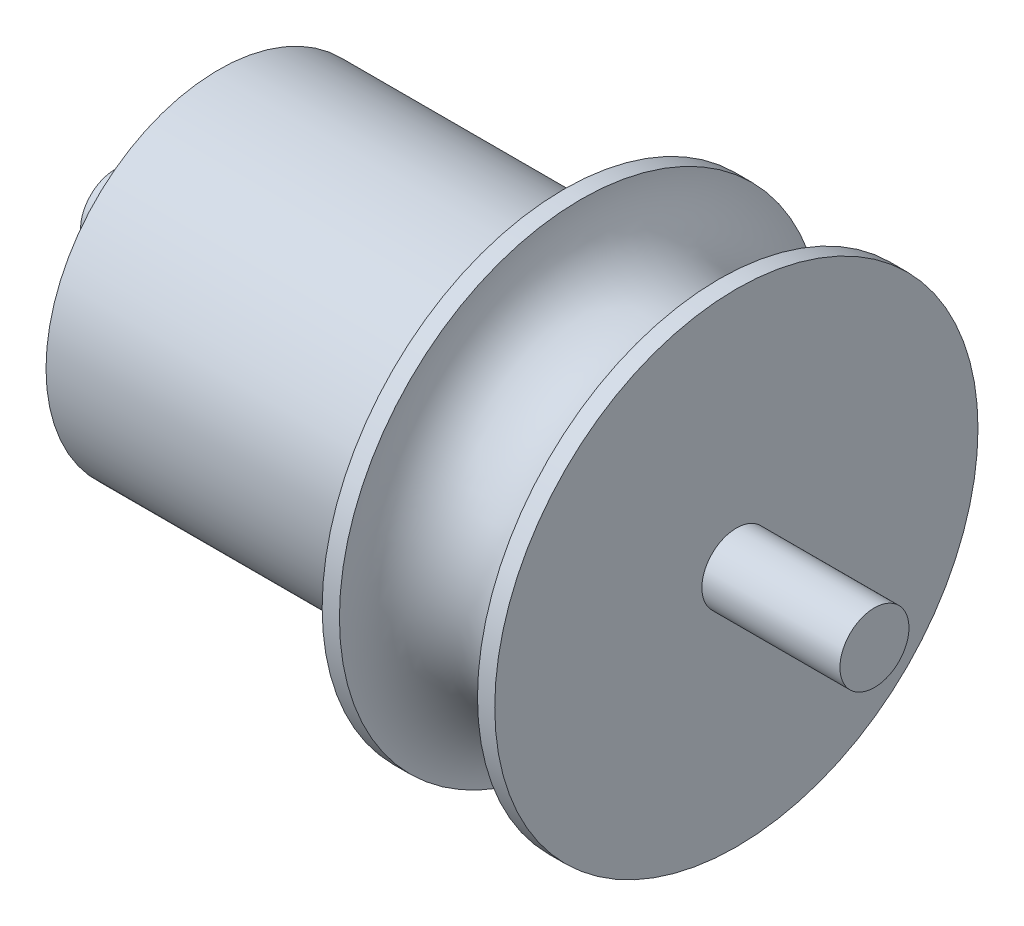
ISO-10303-21;
HEADER;
FILE_DESCRIPTION(('STEP AP214'),'2;1');
FILE_NAME('part.step','',(''),(''),'','','');
FILE_SCHEMA(('AUTOMOTIVE_DESIGN { 1 0 10303 214 1 1 1 1 }'));
ENDSEC;
DATA;
#1=APPLICATION_CONTEXT('core data for automotive mechanical design processes');
#2=APPLICATION_PROTOCOL_DEFINITION('international standard','automotive_design',2000,#1);
#3=PRODUCT_CONTEXT('',#1,'mechanical');
#4=PRODUCT('Part','Part','',(#3));
#5=PRODUCT_RELATED_PRODUCT_CATEGORY('part','',(#4));
#6=PRODUCT_DEFINITION_FORMATION('','',#4);
#7=PRODUCT_DEFINITION_CONTEXT('part definition',#1,'design');
#8=PRODUCT_DEFINITION('design','',#6,#7);
#9=PRODUCT_DEFINITION_SHAPE('','',#8);
#10=(LENGTH_UNIT() NAMED_UNIT(*) SI_UNIT(.MILLI.,.METRE.));
#11=(NAMED_UNIT(*) PLANE_ANGLE_UNIT() SI_UNIT($,.RADIAN.));
#12=(NAMED_UNIT(*) SI_UNIT($,.STERADIAN.) SOLID_ANGLE_UNIT());
#13=UNCERTAINTY_MEASURE_WITH_UNIT(LENGTH_MEASURE(1.E-05),#10,'distance_accuracy_value','');
#14=(GEOMETRIC_REPRESENTATION_CONTEXT(3) GLOBAL_UNCERTAINTY_ASSIGNED_CONTEXT((#13)) GLOBAL_UNIT_ASSIGNED_CONTEXT((#10,
#11,#12)) REPRESENTATION_CONTEXT('',''));
#15=CARTESIAN_POINT('',(0.,0.,0.));
#16=DIRECTION('',(0.,0.,1.));
#17=DIRECTION('',(1.,0.,0.));
#18=AXIS2_PLACEMENT_3D('',#15,#16,#17);
#19=CARTESIAN_POINT('',(0.,0.,0.));
#20=DIRECTION('',(1.,0.,0.));
#21=DIRECTION('',(0.,0.,-1.));
#22=AXIS2_PLACEMENT_3D('',#19,#20,#21);
#23=PLANE('',#22);
#24=CARTESIAN_POINT('',(0.,0.,0.));
#25=DIRECTION('',(1.,0.,0.));
#26=DIRECTION('',(0.,0.,-1.));
#27=AXIS2_PLACEMENT_3D('',#24,#25,#26);
#28=CIRCLE('',#27,5.);
#29=CARTESIAN_POINT('',(0.,0.,-5.));
#30=VERTEX_POINT('',#29);
#31=EDGE_CURVE('E58',#30,#30,#28,.T.);
#32=ORIENTED_EDGE('',*,*,#31,.T.);
#33=EDGE_LOOP('',(#32));
#34=FACE_BOUND('',#33,.T.);
#35=CARTESIAN_POINT('',(0.,0.,0.));
#36=DIRECTION('',(-1.,0.,0.));
#37=DIRECTION('',(0.,0.,1.));
#38=AXIS2_PLACEMENT_3D('',#35,#36,#37);
#39=CIRCLE('',#38,25.);
#40=CARTESIAN_POINT('',(0.,0.,25.));
#41=VERTEX_POINT('',#40);
#42=EDGE_CURVE('E55',#41,#41,#39,.T.);
#43=ORIENTED_EDGE('',*,*,#42,.T.);
#44=EDGE_LOOP('',(#43));
#45=FACE_BOUND('',#44,.T.);
#46=ADVANCED_FACE('F33',(#34,#45),#23,.F.);
#47=CARTESIAN_POINT('',(75.,35.,0.));
#48=DIRECTION('',(-1.,0.,0.));
#49=DIRECTION('',(0.,0.,1.));
#50=AXIS2_PLACEMENT_3D('',#47,#48,#49);
#51=PLANE('',#50);
#52=CARTESIAN_POINT('',(75.,0.,0.));
#53=DIRECTION('',(-1.,0.,0.));
#54=DIRECTION('',(0.,0.,1.));
#55=AXIS2_PLACEMENT_3D('',#52,#53,#54);
#56=CIRCLE('',#55,5.);
#57=CARTESIAN_POINT('',(75.,0.,-5.));
#58=VERTEX_POINT('',#57);
#59=EDGE_CURVE('E36',#58,#58,#56,.T.);
#60=ORIENTED_EDGE('',*,*,#59,.T.);
#61=EDGE_LOOP('',(#60));
#62=FACE_BOUND('',#61,.T.);
#63=CARTESIAN_POINT('',(75.,0.,0.));
#64=DIRECTION('',(-1.,0.,0.));
#65=DIRECTION('',(0.,0.,1.));
#66=AXIS2_PLACEMENT_3D('',#63,#64,#65);
#67=CIRCLE('',#66,35.);
#68=CARTESIAN_POINT('',(75.,0.,35.));
#69=VERTEX_POINT('',#68);
#70=EDGE_CURVE('E10',#69,#69,#67,.T.);
#71=ORIENTED_EDGE('',*,*,#70,.F.);
#72=EDGE_LOOP('',(#71));
#73=FACE_BOUND('',#72,.T.);
#74=ADVANCED_FACE('F78',(#62,#73),#51,.F.);
#75=CARTESIAN_POINT('',(0.,0.,0.));
#76=DIRECTION('',(-1.,0.,0.));
#77=DIRECTION('',(0.,0.,1.));
#78=AXIS2_PLACEMENT_3D('',#75,#76,#77);
#79=CYLINDRICAL_SURFACE('',#78,35.);
#80=CARTESIAN_POINT('',(72.5,0.,0.));
#81=DIRECTION('',(-1.,0.,0.));
#82=DIRECTION('',(0.,0.,1.));
#83=AXIS2_PLACEMENT_3D('',#80,#81,#82);
#84=CIRCLE('',#83,35.);
#85=CARTESIAN_POINT('',(72.5,0.,35.));
#86=VERTEX_POINT('',#85);
#87=EDGE_CURVE('E40',#86,#86,#84,.T.);
#88=ORIENTED_EDGE('',*,*,#87,.F.);
#89=EDGE_LOOP('',(#88));
#90=FACE_BOUND('',#89,.T.);
#91=ORIENTED_EDGE('',*,*,#70,.T.);
#92=EDGE_LOOP('',(#91));
#93=FACE_BOUND('',#92,.T.);
#94=ADVANCED_FACE('F81',(#90,#93),#79,.T.);
#95=CARTESIAN_POINT('',(62.5,0.,0.));
#96=DIRECTION('',(-1.,0.,0.));
#97=DIRECTION('',(0.,0.,1.));
#98=AXIS2_PLACEMENT_3D('',#95,#96,#97);
#99=TOROIDAL_SURFACE('',#98,35.,10.);
#100=CARTESIAN_POINT('',(52.5,0.,0.));
#101=DIRECTION('',(-1.,0.,0.));
#102=DIRECTION('',(0.,0.,1.));
#103=AXIS2_PLACEMENT_3D('',#100,#101,#102);
#104=CIRCLE('',#103,35.);
#105=CARTESIAN_POINT('',(52.5,0.,35.));
#106=VERTEX_POINT('',#105);
#107=EDGE_CURVE('E44',#106,#106,#104,.T.);
#108=ORIENTED_EDGE('',*,*,#107,.F.);
#109=EDGE_LOOP('',(#108));
#110=FACE_BOUND('',#109,.T.);
#111=ORIENTED_EDGE('',*,*,#87,.T.);
#112=EDGE_LOOP('',(#111));
#113=FACE_BOUND('',#112,.T.);
#114=ADVANCED_FACE('F87',(#110,#113),#99,.F.);
#115=CARTESIAN_POINT('',(0.,0.,0.));
#116=DIRECTION('',(-1.,0.,0.));
#117=DIRECTION('',(0.,0.,1.));
#118=AXIS2_PLACEMENT_3D('',#115,#116,#117);
#119=CYLINDRICAL_SURFACE('',#118,35.);
#120=CARTESIAN_POINT('',(50.,0.,0.));
#121=DIRECTION('',(-1.,0.,0.));
#122=DIRECTION('',(0.,0.,1.));
#123=AXIS2_PLACEMENT_3D('',#120,#121,#122);
#124=CIRCLE('',#123,35.);
#125=CARTESIAN_POINT('',(50.,0.,35.));
#126=VERTEX_POINT('',#125);
#127=EDGE_CURVE('E49',#126,#126,#124,.T.);
#128=ORIENTED_EDGE('',*,*,#127,.F.);
#129=EDGE_LOOP('',(#128));
#130=FACE_BOUND('',#129,.T.);
#131=ORIENTED_EDGE('',*,*,#107,.T.);
#132=EDGE_LOOP('',(#131));
#133=FACE_BOUND('',#132,.T.);
#134=ADVANCED_FACE('F94',(#130,#133),#119,.T.);
#135=CARTESIAN_POINT('',(50.,25.,0.));
#136=DIRECTION('',(1.,0.,0.));
#137=DIRECTION('',(0.,0.,-1.));
#138=AXIS2_PLACEMENT_3D('',#135,#136,#137);
#139=PLANE('',#138);
#140=CARTESIAN_POINT('',(50.,0.,0.));
#141=DIRECTION('',(-1.,0.,0.));
#142=DIRECTION('',(0.,0.,1.));
#143=AXIS2_PLACEMENT_3D('',#140,#141,#142);
#144=CIRCLE('',#143,25.);
#145=CARTESIAN_POINT('',(50.,0.,25.));
#146=VERTEX_POINT('',#145);
#147=EDGE_CURVE('E52',#146,#146,#144,.T.);
#148=ORIENTED_EDGE('',*,*,#147,.F.);
#149=EDGE_LOOP('',(#148));
#150=FACE_BOUND('',#149,.T.);
#151=ORIENTED_EDGE('',*,*,#127,.T.);
#152=EDGE_LOOP('',(#151));
#153=FACE_BOUND('',#152,.T.);
#154=ADVANCED_FACE('F98',(#150,#153),#139,.F.);
#155=CARTESIAN_POINT('',(0.,0.,0.));
#156=DIRECTION('',(-1.,0.,0.));
#157=DIRECTION('',(0.,0.,1.));
#158=AXIS2_PLACEMENT_3D('',#155,#156,#157);
#159=CYLINDRICAL_SURFACE('',#158,25.);
#160=ORIENTED_EDGE('',*,*,#42,.F.);
#161=EDGE_LOOP('',(#160));
#162=FACE_BOUND('',#161,.T.);
#163=ORIENTED_EDGE('',*,*,#147,.T.);
#164=EDGE_LOOP('',(#163));
#165=FACE_BOUND('',#164,.T.);
#166=ADVANCED_FACE('F102',(#162,#165),#159,.T.);
#167=CARTESIAN_POINT('',(95.,0.,0.));
#168=DIRECTION('',(1.,0.,0.));
#169=DIRECTION('',(0.,0.,-1.));
#170=AXIS2_PLACEMENT_3D('',#167,#168,#169);
#171=PLANE('',#170);
#172=CARTESIAN_POINT('',(95.,0.,0.));
#173=DIRECTION('',(1.,0.,0.));
#174=DIRECTION('',(0.,0.,-1.));
#175=AXIS2_PLACEMENT_3D('',#172,#173,#174);
#176=CIRCLE('',#175,5.);
#177=CARTESIAN_POINT('',(95.,0.,-5.));
#178=VERTEX_POINT('',#177);
#179=EDGE_CURVE('E64',#178,#178,#176,.T.);
#180=ORIENTED_EDGE('',*,*,#179,.T.);
#181=EDGE_LOOP('',(#180));
#182=FACE_BOUND('',#181,.T.);
#183=ADVANCED_FACE('F68',(#182),#171,.T.);
#184=CARTESIAN_POINT('',(-15.,0.,0.));
#185=DIRECTION('',(1.,0.,0.));
#186=DIRECTION('',(0.,0.,-1.));
#187=AXIS2_PLACEMENT_3D('',#184,#185,#186);
#188=CYLINDRICAL_SURFACE('',#187,5.);
#189=CARTESIAN_POINT('',(95.,0.,-5.));
#190=CARTESIAN_POINT('',(94.7916666666667,0.,-5.));
#191=CARTESIAN_POINT('',(94.5833333333334,0.,-5.));
#192=CARTESIAN_POINT('',(94.1666666666667,0.,-5.));
#193=CARTESIAN_POINT('',(93.9583333333334,0.,-5.));
#194=CARTESIAN_POINT('',(93.5416666666667,0.,-5.));
#195=CARTESIAN_POINT('',(93.3333333333334,0.,-5.));
#196=CARTESIAN_POINT('',(92.9166666666667,0.,-5.));
#197=CARTESIAN_POINT('',(92.7083333333334,0.,-5.));
#198=CARTESIAN_POINT('',(92.2916666666667,0.,-5.));
#199=CARTESIAN_POINT('',(92.0833333333334,0.,-5.));
#200=CARTESIAN_POINT('',(91.6666666666667,0.,-5.));
#201=CARTESIAN_POINT('',(91.4583333333333,0.,-5.));
#202=CARTESIAN_POINT('',(91.0416666666667,0.,-5.));
#203=CARTESIAN_POINT('',(90.8333333333333,0.,-5.));
#204=CARTESIAN_POINT('',(90.4166666666667,0.,-5.));
#205=CARTESIAN_POINT('',(90.2083333333333,0.,-5.));
#206=CARTESIAN_POINT('',(89.7916666666667,0.,-5.));
#207=CARTESIAN_POINT('',(89.5833333333333,0.,-5.));
#208=CARTESIAN_POINT('',(89.1666666666667,0.,-5.));
#209=CARTESIAN_POINT('',(88.9583333333334,0.,-5.));
#210=CARTESIAN_POINT('',(88.5416666666667,0.,-5.));
#211=CARTESIAN_POINT('',(88.3333333333334,0.,-5.));
#212=CARTESIAN_POINT('',(87.9166666666667,0.,-5.));
#213=CARTESIAN_POINT('',(87.7083333333334,0.,-5.));
#214=CARTESIAN_POINT('',(87.2916666666667,0.,-5.));
#215=CARTESIAN_POINT('',(87.0833333333334,0.,-5.));
#216=CARTESIAN_POINT('',(86.6666666666667,0.,-5.));
#217=CARTESIAN_POINT('',(86.4583333333334,0.,-5.));
#218=CARTESIAN_POINT('',(86.0416666666667,0.,-5.));
#219=CARTESIAN_POINT('',(85.8333333333334,0.,-5.));
#220=CARTESIAN_POINT('',(85.4166666666667,0.,-5.));
#221=CARTESIAN_POINT('',(85.2083333333334,0.,-5.));
#222=CARTESIAN_POINT('',(84.7916666666667,0.,-5.));
#223=CARTESIAN_POINT('',(84.5833333333334,0.,-5.));
#224=CARTESIAN_POINT('',(84.1666666666667,0.,-5.));
#225=CARTESIAN_POINT('',(83.9583333333334,0.,-5.));
#226=CARTESIAN_POINT('',(83.5416666666667,0.,-5.));
#227=CARTESIAN_POINT('',(83.3333333333334,0.,-5.));
#228=CARTESIAN_POINT('',(82.9166666666667,0.,-5.));
#229=CARTESIAN_POINT('',(82.7083333333334,0.,-5.));
#230=CARTESIAN_POINT('',(82.2916666666667,0.,-5.));
#231=CARTESIAN_POINT('',(82.0833333333334,0.,-5.));
#232=CARTESIAN_POINT('',(81.6666666666667,0.,-5.));
#233=CARTESIAN_POINT('',(81.4583333333334,0.,-5.));
#234=CARTESIAN_POINT('',(81.0416666666667,0.,-5.));
#235=CARTESIAN_POINT('',(80.8333333333334,0.,-5.));
#236=CARTESIAN_POINT('',(80.4166666666667,0.,-5.));
#237=CARTESIAN_POINT('',(80.2083333333334,0.,-5.));
#238=CARTESIAN_POINT('',(79.7916666666667,0.,-5.));
#239=CARTESIAN_POINT('',(79.5833333333334,0.,-5.));
#240=CARTESIAN_POINT('',(79.1666666666667,0.,-5.));
#241=CARTESIAN_POINT('',(78.9583333333334,0.,-5.));
#242=CARTESIAN_POINT('',(78.5416666666667,0.,-5.));
#243=CARTESIAN_POINT('',(78.3333333333334,0.,-5.));
#244=CARTESIAN_POINT('',(77.9166666666667,0.,-5.));
#245=CARTESIAN_POINT('',(77.7083333333334,0.,-5.));
#246=CARTESIAN_POINT('',(77.2916666666667,0.,-5.));
#247=CARTESIAN_POINT('',(77.0833333333334,0.,-5.));
#248=CARTESIAN_POINT('',(76.6666666666667,0.,-5.));
#249=CARTESIAN_POINT('',(76.4583333333334,0.,-5.));
#250=CARTESIAN_POINT('',(76.0416666666667,0.,-5.));
#251=CARTESIAN_POINT('',(75.8333333333334,0.,-5.));
#252=CARTESIAN_POINT('',(75.4166666666667,0.,-5.));
#253=CARTESIAN_POINT('',(75.2083333333334,0.,-5.));
#254=CARTESIAN_POINT('',(75.,0.,-5.));
#255=B_SPLINE_CURVE_WITH_KNOTS('',3,(#189,#190,#191,#192,#193,#194,#195,#196,#197,#198,#199,
#200,#201,#202,#203,#204,#205,#206,#207,#208,#209,#210,#211,#212,#213,#214,#215,#216,#217,#218,
#219,#220,#221,#222,#223,#224,#225,#226,#227,#228,#229,#230,#231,#232,#233,#234,#235,#236,#237,
#238,#239,#240,#241,#242,#243,#244,#245,#246,#247,#248,#249,#250,#251,#252,#253,#254),
.UNSPECIFIED.,.F.,.F.,(4,2,2,2,2,2,2,2,2,2,2,2,2,2,2,2,2,2,2,2,2,2,2,2,2,2,2,2,2,2,2,2,4),(0.,
0.625000000000001,1.25,1.875,2.5,3.125,3.75,4.375,5.,5.62499999999999,6.24999999999999,
6.87499999999999,7.49999999999999,8.12499999999999,8.74999999999999,9.37499999999999,
9.99999999999999,10.625,11.25,11.875,12.5,13.125,13.75,14.375,15.,15.625,16.25,16.875,17.5,
18.125,18.75,19.375,20.),.UNSPECIFIED.);
#256=EDGE_CURVE('BSEAM70',#178,#58,#255,.T.);
#257=ORIENTED_EDGE('',*,*,#179,.F.);
#258=ORIENTED_EDGE('',*,*,#59,.F.);
#259=ORIENTED_EDGE('',*,*,#256,.T.);
#260=ORIENTED_EDGE('',*,*,#256,.F.);
#261=EDGE_LOOP('',(#257,#259,#258,#260));
#262=FACE_BOUND('',#261,.T.);
#263=ADVANCED_FACE('F70',(#262),#188,.T.);
#264=CARTESIAN_POINT('',(-15.,0.,0.));
#265=DIRECTION('',(1.,0.,0.));
#266=DIRECTION('',(0.,0.,-1.));
#267=AXIS2_PLACEMENT_3D('',#264,#265,#266);
#268=CIRCLE('',#267,5.);
#269=CARTESIAN_POINT('',(-15.,0.,-5.));
#270=VERTEX_POINT('',#269);
#271=EDGE_CURVE('E61',#270,#270,#268,.T.);
#272=CARTESIAN_POINT('',(-15.,0.,-5.));
#273=CARTESIAN_POINT('',(-14.84375,0.,-5.));
#274=CARTESIAN_POINT('',(-14.6875,0.,-5.));
#275=CARTESIAN_POINT('',(-14.375,0.,-5.));
#276=CARTESIAN_POINT('',(-14.21875,0.,-5.));
#277=CARTESIAN_POINT('',(-13.90625,0.,-5.));
#278=CARTESIAN_POINT('',(-13.75,0.,-5.));
#279=CARTESIAN_POINT('',(-13.4375,0.,-5.));
#280=CARTESIAN_POINT('',(-13.28125,0.,-5.));
#281=CARTESIAN_POINT('',(-12.96875,0.,-5.));
#282=CARTESIAN_POINT('',(-12.8125,0.,-5.));
#283=CARTESIAN_POINT('',(-12.5,0.,-5.));
#284=CARTESIAN_POINT('',(-12.34375,0.,-5.));
#285=CARTESIAN_POINT('',(-12.03125,0.,-5.));
#286=CARTESIAN_POINT('',(-11.875,0.,-5.));
#287=CARTESIAN_POINT('',(-11.5625,0.,-5.));
#288=CARTESIAN_POINT('',(-11.40625,0.,-5.));
#289=CARTESIAN_POINT('',(-11.09375,0.,-5.));
#290=CARTESIAN_POINT('',(-10.9375,0.,-5.));
#291=CARTESIAN_POINT('',(-10.625,0.,-5.));
#292=CARTESIAN_POINT('',(-10.46875,0.,-5.));
#293=CARTESIAN_POINT('',(-10.15625,0.,-5.));
#294=CARTESIAN_POINT('',(-9.99999999999999,0.,-5.));
#295=CARTESIAN_POINT('',(-9.68749999999999,0.,-5.));
#296=CARTESIAN_POINT('',(-9.53124999999999,0.,-5.));
#297=CARTESIAN_POINT('',(-9.21874999999999,0.,-5.));
#298=CARTESIAN_POINT('',(-9.06249999999999,0.,-5.));
#299=CARTESIAN_POINT('',(-8.74999999999999,0.,-5.));
#300=CARTESIAN_POINT('',(-8.59374999999999,0.,-5.));
#301=CARTESIAN_POINT('',(-8.28124999999999,0.,-5.));
#302=CARTESIAN_POINT('',(-8.12499999999999,0.,-5.));
#303=CARTESIAN_POINT('',(-7.81249999999999,0.,-5.));
#304=CARTESIAN_POINT('',(-7.65624999999999,0.,-5.));
#305=CARTESIAN_POINT('',(-7.34374999999999,0.,-5.));
#306=CARTESIAN_POINT('',(-7.18749999999999,0.,-5.));
#307=CARTESIAN_POINT('',(-6.875,0.,-5.));
#308=CARTESIAN_POINT('',(-6.71875,0.,-5.));
#309=CARTESIAN_POINT('',(-6.40625,0.,-5.));
#310=CARTESIAN_POINT('',(-6.25,0.,-5.));
#311=CARTESIAN_POINT('',(-5.9375,0.,-5.));
#312=CARTESIAN_POINT('',(-5.78125,0.,-5.));
#313=CARTESIAN_POINT('',(-5.46875,0.,-5.));
#314=CARTESIAN_POINT('',(-5.3125,0.,-5.));
#315=CARTESIAN_POINT('',(-5.,0.,-5.));
#316=CARTESIAN_POINT('',(-4.84375,0.,-5.));
#317=CARTESIAN_POINT('',(-4.53125,0.,-5.));
#318=CARTESIAN_POINT('',(-4.375,0.,-5.));
#319=CARTESIAN_POINT('',(-4.0625,0.,-5.));
#320=CARTESIAN_POINT('',(-3.90625,0.,-5.));
#321=CARTESIAN_POINT('',(-3.59375,0.,-5.));
#322=CARTESIAN_POINT('',(-3.4375,0.,-5.));
#323=CARTESIAN_POINT('',(-3.125,0.,-5.));
#324=CARTESIAN_POINT('',(-2.96875,0.,-5.));
#325=CARTESIAN_POINT('',(-2.65625,0.,-5.));
#326=CARTESIAN_POINT('',(-2.5,0.,-5.));
#327=CARTESIAN_POINT('',(-2.1875,0.,-5.));
#328=CARTESIAN_POINT('',(-2.03125,0.,-5.));
#329=CARTESIAN_POINT('',(-1.71875,0.,-5.));
#330=CARTESIAN_POINT('',(-1.5625,0.,-5.));
#331=CARTESIAN_POINT('',(-1.25,0.,-5.));
#332=CARTESIAN_POINT('',(-1.09375,0.,-5.));
#333=CARTESIAN_POINT('',(-0.781250000000001,0.,-5.));
#334=CARTESIAN_POINT('',(-0.625000000000002,0.,-5.));
#335=CARTESIAN_POINT('',(-0.312500000000002,0.,-5.));
#336=CARTESIAN_POINT('',(-0.156250000000002,0.,-5.));
#337=CARTESIAN_POINT('',(0.,0.,-5.));
#338=B_SPLINE_CURVE_WITH_KNOTS('',3,(#272,#273,#274,#275,#276,#277,#278,#279,#280,#281,#282,
#283,#284,#285,#286,#287,#288,#289,#290,#291,#292,#293,#294,#295,#296,#297,#298,#299,#300,#301,
#302,#303,#304,#305,#306,#307,#308,#309,#310,#311,#312,#313,#314,#315,#316,#317,#318,#319,#320,
#321,#322,#323,#324,#325,#326,#327,#328,#329,#330,#331,#332,#333,#334,#335,#336,#337),
.UNSPECIFIED.,.F.,.F.,(4,2,2,2,2,2,2,2,2,2,2,2,2,2,2,2,2,2,2,2,2,2,2,2,2,2,2,2,2,2,2,2,4),(0.,
0.46875,0.937499999999999,1.40625,1.875,2.34375,2.8125,3.28125,3.75,4.21875,4.6875,5.15625,
5.625,6.09374999999999,6.56249999999999,7.03124999999999,7.49999999999999,7.96874999999999,
8.43749999999999,8.90624999999999,9.37499999999999,9.84374999999999,10.3125,10.78125,11.25,
11.71875,12.1875,12.65625,13.125,13.59375,14.0625,14.53125,15.),.UNSPECIFIED.);
#339=EDGE_CURVE('BSEAM73',#270,#30,#338,.T.);
#340=ORIENTED_EDGE('',*,*,#271,.T.);
#341=ORIENTED_EDGE('',*,*,#31,.F.);
#342=ORIENTED_EDGE('',*,*,#339,.T.);
#343=ORIENTED_EDGE('',*,*,#339,.F.);
#344=EDGE_LOOP('',(#340,#342,#341,#343));
#345=FACE_BOUND('',#344,.T.);
#346=ADVANCED_FACE('F73',(#345),#188,.T.);
#347=CARTESIAN_POINT('',(-15.,0.,0.));
#348=DIRECTION('',(1.,0.,0.));
#349=DIRECTION('',(0.,0.,-1.));
#350=AXIS2_PLACEMENT_3D('',#347,#348,#349);
#351=PLANE('',#350);
#352=ORIENTED_EDGE('',*,*,#271,.F.);
#353=EDGE_LOOP('',(#352));
#354=FACE_BOUND('',#353,.T.);
#355=ADVANCED_FACE('F108',(#354),#351,.F.);
#356=CLOSED_SHELL('',(#46,#74,#94,#114,#134,#154,#166,#183,#263,#346,#355));
#357=MANIFOLD_SOLID_BREP('B2',#356);
#358=ADVANCED_BREP_SHAPE_REPRESENTATION('',(#18,#357),#14);
#359=SHAPE_DEFINITION_REPRESENTATION(#9,#358);
ENDSEC;
END-ISO-10303-21;
